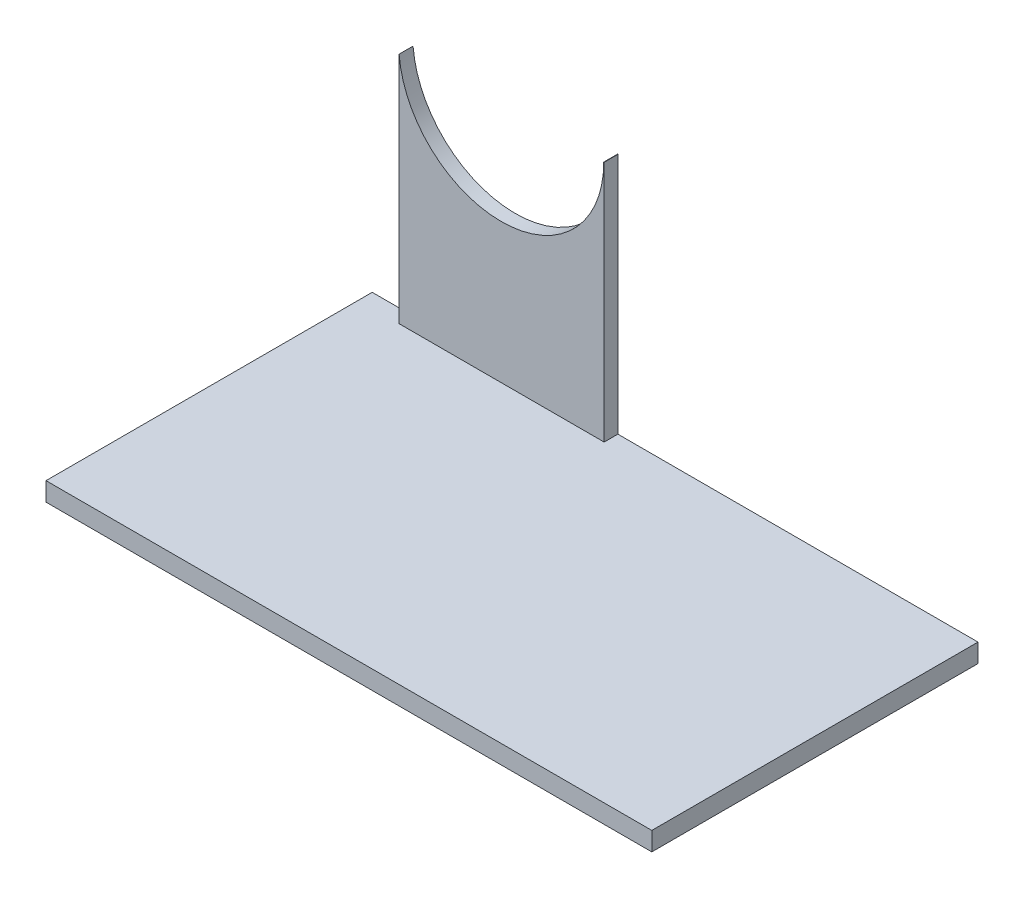
ISO-10303-21;
HEADER;
FILE_DESCRIPTION(('STEP AP214'),'2;1');
FILE_NAME('part.step','',(''),(''),'','','');
FILE_SCHEMA(('AUTOMOTIVE_DESIGN { 1 0 10303 214 1 1 1 1 }'));
ENDSEC;
DATA;
#1=APPLICATION_CONTEXT('core data for automotive mechanical design processes');
#2=APPLICATION_PROTOCOL_DEFINITION('international standard','automotive_design',2000,#1);
#3=PRODUCT_CONTEXT('',#1,'mechanical');
#4=PRODUCT('Part','Part','',(#3));
#5=PRODUCT_RELATED_PRODUCT_CATEGORY('part','',(#4));
#6=PRODUCT_DEFINITION_FORMATION('','',#4);
#7=PRODUCT_DEFINITION_CONTEXT('part definition',#1,'design');
#8=PRODUCT_DEFINITION('design','',#6,#7);
#9=PRODUCT_DEFINITION_SHAPE('','',#8);
#10=(LENGTH_UNIT() NAMED_UNIT(*) SI_UNIT(.MILLI.,.METRE.));
#11=(NAMED_UNIT(*) PLANE_ANGLE_UNIT() SI_UNIT($,.RADIAN.));
#12=(NAMED_UNIT(*) SI_UNIT($,.STERADIAN.) SOLID_ANGLE_UNIT());
#13=UNCERTAINTY_MEASURE_WITH_UNIT(LENGTH_MEASURE(1.E-05),#10,'distance_accuracy_value','');
#14=(GEOMETRIC_REPRESENTATION_CONTEXT(3) GLOBAL_UNCERTAINTY_ASSIGNED_CONTEXT((#13)) GLOBAL_UNIT_ASSIGNED_CONTEXT((#10,
#11,#12)) REPRESENTATION_CONTEXT('',''));
#15=CARTESIAN_POINT('',(0.,0.,0.));
#16=DIRECTION('',(0.,0.,1.));
#17=DIRECTION('',(1.,0.,0.));
#18=AXIS2_PLACEMENT_3D('',#15,#16,#17);
#19=CARTESIAN_POINT('',(-23.7948717948718,77.824115301167,-15.5897435897436));
#20=DIRECTION('',(1.,0.,0.));
#21=DIRECTION('',(0.,0.,-1.));
#22=AXIS2_PLACEMENT_3D('',#19,#20,#21);
#23=PLANE('',#22);
#24=DIRECTION('',(0.,0.,1.));
#25=VECTOR('',#24,1.);
#26=CARTESIAN_POINT('',(-23.7948717948718,2.,-15.5897435897436));
#27=LINE('',#26,#25);
#28=CARTESIAN_POINT('',(-23.7948717948718,2.,-15.5897435897436));
#29=VERTEX_POINT('',#28);
#30=CARTESIAN_POINT('',(-23.7948717948718,2.,19.4102564102564));
#31=VERTEX_POINT('',#30);
#32=EDGE_CURVE('E193',#29,#31,#27,.T.);
#33=ORIENTED_EDGE('',*,*,#32,.F.);
#34=DIRECTION('',(0.,-1.,0.));
#35=VECTOR('',#34,1.);
#36=CARTESIAN_POINT('',(-23.7948717948718,77.824115301167,-15.5897435897436));
#37=LINE('',#36,#35);
#38=CARTESIAN_POINT('',(-23.7948717948718,0.,-15.5897435897436));
#39=VERTEX_POINT('',#38);
#40=EDGE_CURVE('E184',#29,#39,#37,.T.);
#41=ORIENTED_EDGE('',*,*,#40,.T.);
#42=DIRECTION('',(0.,0.,1.));
#43=VECTOR('',#42,1.);
#44=CARTESIAN_POINT('',(-23.7948717948718,0.,-15.5897435897436));
#45=LINE('',#44,#43);
#46=CARTESIAN_POINT('',(-23.7948717948718,0.,19.4102564102564));
#47=VERTEX_POINT('',#46);
#48=EDGE_CURVE('E180',#39,#47,#45,.T.);
#49=ORIENTED_EDGE('',*,*,#48,.T.);
#50=DIRECTION('',(0.,-1.,0.));
#51=VECTOR('',#50,1.);
#52=CARTESIAN_POINT('',(-23.7948717948718,77.824115301167,19.4102564102564));
#53=LINE('',#52,#51);
#54=EDGE_CURVE('E179',#31,#47,#53,.T.);
#55=ORIENTED_EDGE('',*,*,#54,.F.);
#56=EDGE_LOOP('',(#33,#41,#49,#55));
#57=FACE_BOUND('',#56,.T.);
#58=ADVANCED_FACE('F42',(#57),#23,.F.);
#59=CARTESIAN_POINT('',(-23.7948717948718,77.824115301167,19.4102564102564));
#60=DIRECTION('',(0.,0.,-1.));
#61=DIRECTION('',(-1.,0.,0.));
#62=AXIS2_PLACEMENT_3D('',#59,#60,#61);
#63=PLANE('',#62);
#64=DIRECTION('',(1.,0.,0.));
#65=VECTOR('',#64,1.);
#66=CARTESIAN_POINT('',(-23.7948717948718,2.,19.4102564102564));
#67=LINE('',#66,#65);
#68=CARTESIAN_POINT('',(41.2051282051282,2.,19.4102564102564));
#69=VERTEX_POINT('',#68);
#70=EDGE_CURVE('E189',#31,#69,#67,.T.);
#71=ORIENTED_EDGE('',*,*,#70,.F.);
#72=ORIENTED_EDGE('',*,*,#54,.T.);
#73=DIRECTION('',(1.,0.,0.));
#74=VECTOR('',#73,1.);
#75=CARTESIAN_POINT('',(-23.7948717948718,0.,19.4102564102564));
#76=LINE('',#75,#74);
#77=CARTESIAN_POINT('',(41.2051282051282,0.,19.4102564102564));
#78=VERTEX_POINT('',#77);
#79=EDGE_CURVE('E175',#47,#78,#76,.T.);
#80=ORIENTED_EDGE('',*,*,#79,.T.);
#81=DIRECTION('',(0.,-1.,0.));
#82=VECTOR('',#81,1.);
#83=CARTESIAN_POINT('',(41.2051282051282,77.824115301167,19.4102564102564));
#84=LINE('',#83,#82);
#85=EDGE_CURVE('E174',#69,#78,#84,.T.);
#86=ORIENTED_EDGE('',*,*,#85,.F.);
#87=EDGE_LOOP('',(#71,#72,#80,#86));
#88=FACE_BOUND('',#87,.T.);
#89=ADVANCED_FACE('F244',(#88),#63,.F.);
#90=CARTESIAN_POINT('',(41.2051282051282,77.824115301167,-15.5897435897436));
#91=DIRECTION('',(-1.,0.,0.));
#92=DIRECTION('',(0.,0.,1.));
#93=AXIS2_PLACEMENT_3D('',#90,#91,#92);
#94=PLANE('',#93);
#95=DIRECTION('',(0.,0.,-1.));
#96=VECTOR('',#95,1.);
#97=CARTESIAN_POINT('',(41.2051282051282,2.,-15.5897435897436));
#98=LINE('',#97,#96);
#99=CARTESIAN_POINT('',(41.2051282051282,2.,-15.5897435897436));
#100=VERTEX_POINT('',#99);
#101=EDGE_CURVE('E185',#69,#100,#98,.T.);
#102=ORIENTED_EDGE('',*,*,#101,.F.);
#103=ORIENTED_EDGE('',*,*,#85,.T.);
#104=DIRECTION('',(0.,0.,-1.));
#105=VECTOR('',#104,1.);
#106=CARTESIAN_POINT('',(41.2051282051282,0.,-15.5897435897436));
#107=LINE('',#106,#105);
#108=CARTESIAN_POINT('',(41.2051282051282,0.,-15.5897435897436));
#109=VERTEX_POINT('',#108);
#110=EDGE_CURVE('E170',#78,#109,#107,.T.);
#111=ORIENTED_EDGE('',*,*,#110,.T.);
#112=DIRECTION('',(0.,-1.,0.));
#113=VECTOR('',#112,1.);
#114=CARTESIAN_POINT('',(41.2051282051282,77.824115301167,-15.5897435897436));
#115=LINE('',#114,#113);
#116=EDGE_CURVE('E169',#100,#109,#115,.T.);
#117=ORIENTED_EDGE('',*,*,#116,.F.);
#118=EDGE_LOOP('',(#102,#103,#111,#117));
#119=FACE_BOUND('',#118,.T.);
#120=ADVANCED_FACE('F250',(#119),#94,.F.);
#121=CARTESIAN_POINT('',(-23.7948717948718,77.824115301167,-15.5897435897436));
#122=DIRECTION('',(0.,0.,1.));
#123=DIRECTION('',(1.,0.,0.));
#124=AXIS2_PLACEMENT_3D('',#121,#122,#123);
#125=PLANE('',#124);
#126=DIRECTION('',(-1.,0.,0.));
#127=VECTOR('',#126,1.);
#128=CARTESIAN_POINT('',(-23.7948717948718,2.,-15.5897435897436));
#129=LINE('',#128,#127);
#130=CARTESIAN_POINT('',(2.56561817411338,2.,-15.5897435897436));
#131=VERTEX_POINT('',#130);
#132=EDGE_CURVE('E197',#100,#131,#129,.T.);
#133=ORIENTED_EDGE('',*,*,#132,.F.);
#134=ORIENTED_EDGE('',*,*,#116,.T.);
#135=DIRECTION('',(-1.,0.,0.));
#136=VECTOR('',#135,1.);
#137=CARTESIAN_POINT('',(-23.7948717948718,0.,-15.5897435897436));
#138=LINE('',#137,#136);
#139=EDGE_CURVE('E164',#109,#39,#138,.T.);
#140=ORIENTED_EDGE('',*,*,#139,.T.);
#141=ORIENTED_EDGE('',*,*,#40,.F.);
#142=CARTESIAN_POINT('',(-19.4374584778743,2.,-15.5897435897436));
#143=VERTEX_POINT('',#142);
#144=EDGE_CURVE('E168',#143,#29,#129,.T.);
#145=ORIENTED_EDGE('',*,*,#144,.F.);
#146=EDGE_CURVE('E201',#131,#143,#129,.T.);
#147=ORIENTED_EDGE('',*,*,#146,.F.);
#148=EDGE_LOOP('',(#133,#134,#140,#141,#145,#147));
#149=FACE_BOUND('',#148,.T.);
#150=ADVANCED_FACE('F238',(#149),#125,.F.);
#151=CARTESIAN_POINT('',(0.,0.,0.));
#152=DIRECTION('',(0.,1.,0.));
#153=DIRECTION('',(0.,0.,1.));
#154=AXIS2_PLACEMENT_3D('',#151,#152,#153);
#155=PLANE('',#154);
#156=ORIENTED_EDGE('',*,*,#48,.F.);
#157=ORIENTED_EDGE('',*,*,#139,.F.);
#158=ORIENTED_EDGE('',*,*,#110,.F.);
#159=ORIENTED_EDGE('',*,*,#79,.F.);
#160=EDGE_LOOP('',(#156,#157,#158,#159));
#161=FACE_BOUND('',#160,.T.);
#162=ADVANCED_FACE('F248',(#161),#155,.F.);
#163=CARTESIAN_POINT('',(0.,2.,0.));
#164=DIRECTION('',(0.,1.,0.));
#165=DIRECTION('',(0.,0.,1.));
#166=AXIS2_PLACEMENT_3D('',#163,#164,#165);
#167=PLANE('',#166);
#168=DIRECTION('',(0.,0.,1.));
#169=VECTOR('',#168,1.);
#170=CARTESIAN_POINT('',(-19.4374584778743,2.,-15.6167906288971));
#171=LINE('',#170,#169);
#172=CARTESIAN_POINT('',(-19.4374584778743,2.,-14.1167906288971));
#173=VERTEX_POINT('',#172);
#174=EDGE_CURVE('E51',#143,#173,#171,.T.);
#175=ORIENTED_EDGE('',*,*,#174,.F.);
#176=ORIENTED_EDGE('',*,*,#144,.T.);
#177=ORIENTED_EDGE('',*,*,#32,.T.);
#178=ORIENTED_EDGE('',*,*,#70,.T.);
#179=ORIENTED_EDGE('',*,*,#101,.T.);
#180=ORIENTED_EDGE('',*,*,#132,.T.);
#181=DIRECTION('',(0.,0.,-1.));
#182=VECTOR('',#181,1.);
#183=CARTESIAN_POINT('',(2.56561817411338,2.,-15.6167906288971));
#184=LINE('',#183,#182);
#185=CARTESIAN_POINT('',(2.56561817411338,2.,-14.1167906288971));
#186=VERTEX_POINT('',#185);
#187=EDGE_CURVE('E160',#186,#131,#184,.T.);
#188=ORIENTED_EDGE('',*,*,#187,.F.);
#189=DIRECTION('',(1.,0.,0.));
#190=VECTOR('',#189,1.);
#191=CARTESIAN_POINT('',(-19.4374584778743,2.,-14.1167906288971));
#192=LINE('',#191,#190);
#193=EDGE_CURVE('E151',#173,#186,#192,.T.);
#194=ORIENTED_EDGE('',*,*,#193,.F.);
#195=EDGE_LOOP('',(#175,#176,#177,#178,#179,#180,#188,#194));
#196=FACE_BOUND('',#195,.T.);
#197=ADVANCED_FACE('F44',(#196),#167,.T.);
#198=CARTESIAN_POINT('',(0.,2.,0.));
#199=DIRECTION('',(0.,1.,0.));
#200=DIRECTION('',(0.,0.,1.));
#201=AXIS2_PLACEMENT_3D('',#198,#199,#200);
#202=PLANE('',#201);
#203=CARTESIAN_POINT('',(2.56561817411338,2.,-15.6167906288971));
#204=VERTEX_POINT('',#203);
#205=EDGE_CURVE('E157',#131,#204,#184,.T.);
#206=ORIENTED_EDGE('',*,*,#205,.F.);
#207=ORIENTED_EDGE('',*,*,#146,.T.);
#208=CARTESIAN_POINT('',(-19.4374584778743,2.,-15.6167906288971));
#209=VERTEX_POINT('',#208);
#210=EDGE_CURVE('E152',#209,#143,#171,.T.);
#211=ORIENTED_EDGE('',*,*,#210,.F.);
#212=DIRECTION('',(-1.,0.,0.));
#213=VECTOR('',#212,1.);
#214=CARTESIAN_POINT('',(-19.4374584778743,2.,-15.6167906288971));
#215=LINE('',#214,#213);
#216=EDGE_CURVE('E140',#204,#209,#215,.T.);
#217=ORIENTED_EDGE('',*,*,#216,.F.);
#218=EDGE_LOOP('',(#206,#207,#211,#217));
#219=FACE_BOUND('',#218,.T.);
#220=ADVANCED_FACE('F254',(#219),#202,.F.);
#221=CARTESIAN_POINT('',(-19.4374584778743,76.0541465977091,-15.6167906288971));
#222=DIRECTION('',(1.,0.,0.));
#223=DIRECTION('',(0.,0.,-1.));
#224=AXIS2_PLACEMENT_3D('',#221,#222,#223);
#225=PLANE('',#224);
#226=DIRECTION('',(0.,-1.,0.));
#227=VECTOR('',#226,1.);
#228=CARTESIAN_POINT('',(-19.4374584778743,76.0541465977091,-14.1167906288971));
#229=LINE('',#228,#227);
#230=CARTESIAN_POINT('',(-19.4374584778743,27.044521570774,-14.1167906288971));
#231=VERTEX_POINT('',#230);
#232=EDGE_CURVE('E64',#231,#173,#229,.T.);
#233=ORIENTED_EDGE('',*,*,#232,.F.);
#234=DIRECTION('',(0.,0.,-1.));
#235=VECTOR('',#234,1.);
#236=CARTESIAN_POINT('',(-19.4374584778743,27.044521570774,19.4102564102564));
#237=LINE('',#236,#235);
#238=CARTESIAN_POINT('',(-19.4374584778743,27.044521570774,-15.6167906288971));
#239=VERTEX_POINT('',#238);
#240=EDGE_CURVE('E163',#231,#239,#237,.T.);
#241=ORIENTED_EDGE('',*,*,#240,.T.);
#242=DIRECTION('',(0.,-1.,0.));
#243=VECTOR('',#242,1.);
#244=CARTESIAN_POINT('',(-19.4374584778743,76.0541465977091,-15.6167906288971));
#245=LINE('',#244,#243);
#246=EDGE_CURVE('E132',#239,#209,#245,.T.);
#247=ORIENTED_EDGE('',*,*,#246,.T.);
#248=ORIENTED_EDGE('',*,*,#210,.T.);
#249=ORIENTED_EDGE('',*,*,#174,.T.);
#250=EDGE_LOOP('',(#233,#241,#247,#248,#249));
#251=FACE_BOUND('',#250,.T.);
#252=ADVANCED_FACE('F228',(#251),#225,.F.);
#253=CARTESIAN_POINT('',(-19.4374584778743,76.0541465977091,-14.1167906288971));
#254=DIRECTION('',(0.,0.,-1.));
#255=DIRECTION('',(-1.,0.,0.));
#256=AXIS2_PLACEMENT_3D('',#253,#254,#255);
#257=PLANE('',#256);
#258=DIRECTION('',(1.,0.,0.));
#259=VECTOR('',#258,1.);
#260=CARTESIAN_POINT('',(-19.4374584778743,28.,-14.1167906288971));
#261=LINE('',#260,#259);
#262=CARTESIAN_POINT('',(2.52332766828715,28.,-14.1167906288971));
#263=VERTEX_POINT('',#262);
#264=CARTESIAN_POINT('',(2.56561817411338,28.,-14.1167906288971));
#265=VERTEX_POINT('',#264);
#266=EDGE_CURVE('E139',#263,#265,#261,.T.);
#267=ORIENTED_EDGE('',*,*,#266,.F.);
#268=CARTESIAN_POINT('',(-8.47663693483363,27.9720942642143,-14.1167906288971));
#269=DIRECTION('',(0.,0.,-1.));
#270=DIRECTION('',(-1.,0.,0.));
#271=AXIS2_PLACEMENT_3D('',#268,#269,#270);
#272=CIRCLE('',#271,11.);
#273=EDGE_CURVE('E57',#263,#231,#272,.T.);
#274=ORIENTED_EDGE('',*,*,#273,.T.);
#275=ORIENTED_EDGE('',*,*,#232,.T.);
#276=ORIENTED_EDGE('',*,*,#193,.T.);
#277=DIRECTION('',(0.,-1.,0.));
#278=VECTOR('',#277,1.);
#279=CARTESIAN_POINT('',(2.56561817411338,76.0541465977091,-14.1167906288971));
#280=LINE('',#279,#278);
#281=EDGE_CURVE('E153',#265,#186,#280,.T.);
#282=ORIENTED_EDGE('',*,*,#281,.F.);
#283=EDGE_LOOP('',(#267,#274,#275,#276,#282));
#284=FACE_BOUND('',#283,.T.);
#285=ADVANCED_FACE('F224',(#284),#257,.F.);
#286=CARTESIAN_POINT('',(2.56561817411338,76.0541465977091,-15.6167906288971));
#287=DIRECTION('',(-1.,0.,0.));
#288=DIRECTION('',(0.,0.,1.));
#289=AXIS2_PLACEMENT_3D('',#286,#287,#288);
#290=PLANE('',#289);
#291=DIRECTION('',(0.,0.,-1.));
#292=VECTOR('',#291,1.);
#293=CARTESIAN_POINT('',(2.56561817411338,28.,-15.6167906288971));
#294=LINE('',#293,#292);
#295=CARTESIAN_POINT('',(2.56561817411338,28.,-15.6167906288971));
#296=VERTEX_POINT('',#295);
#297=EDGE_CURVE('E137',#265,#296,#294,.T.);
#298=ORIENTED_EDGE('',*,*,#297,.F.);
#299=ORIENTED_EDGE('',*,*,#281,.T.);
#300=ORIENTED_EDGE('',*,*,#187,.T.);
#301=ORIENTED_EDGE('',*,*,#205,.T.);
#302=DIRECTION('',(0.,-1.,0.));
#303=VECTOR('',#302,1.);
#304=CARTESIAN_POINT('',(2.56561817411338,76.0541465977091,-15.6167906288971));
#305=LINE('',#304,#303);
#306=EDGE_CURVE('E145',#296,#204,#305,.T.);
#307=ORIENTED_EDGE('',*,*,#306,.F.);
#308=EDGE_LOOP('',(#298,#299,#300,#301,#307));
#309=FACE_BOUND('',#308,.T.);
#310=ADVANCED_FACE('F257',(#309),#290,.F.);
#311=CARTESIAN_POINT('',(-19.4374584778743,76.0541465977091,-15.6167906288971));
#312=DIRECTION('',(0.,0.,1.));
#313=DIRECTION('',(1.,0.,0.));
#314=AXIS2_PLACEMENT_3D('',#311,#312,#313);
#315=PLANE('',#314);
#316=ORIENTED_EDGE('',*,*,#246,.F.);
#317=CARTESIAN_POINT('',(-8.47663693483363,27.9720942642143,-15.6167906288971));
#318=DIRECTION('',(0.,0.,-1.));
#319=DIRECTION('',(-1.,0.,0.));
#320=AXIS2_PLACEMENT_3D('',#317,#318,#319);
#321=CIRCLE('',#320,11.);
#322=CARTESIAN_POINT('',(2.52332766828715,28.,-15.6167906288971));
#323=VERTEX_POINT('',#322);
#324=EDGE_CURVE('E119',#323,#239,#321,.T.);
#325=ORIENTED_EDGE('',*,*,#324,.F.);
#326=DIRECTION('',(-1.,0.,0.));
#327=VECTOR('',#326,1.);
#328=CARTESIAN_POINT('',(-19.4374584778743,28.,-15.6167906288971));
#329=LINE('',#328,#327);
#330=EDGE_CURVE('E129',#296,#323,#329,.T.);
#331=ORIENTED_EDGE('',*,*,#330,.F.);
#332=ORIENTED_EDGE('',*,*,#306,.T.);
#333=ORIENTED_EDGE('',*,*,#216,.T.);
#334=EDGE_LOOP('',(#316,#325,#331,#332,#333));
#335=FACE_BOUND('',#334,.T.);
#336=ADVANCED_FACE('F127',(#335),#315,.F.);
#337=CARTESIAN_POINT('',(0.,28.,0.));
#338=DIRECTION('',(0.,1.,0.));
#339=DIRECTION('',(0.,0.,1.));
#340=AXIS2_PLACEMENT_3D('',#337,#338,#339);
#341=PLANE('',#340);
#342=DIRECTION('',(0.,0.,-1.));
#343=VECTOR('',#342,1.);
#344=CARTESIAN_POINT('',(2.52332766828715,28.,19.4102564102564));
#345=LINE('',#344,#343);
#346=EDGE_CURVE('E13',#263,#323,#345,.T.);
#347=ORIENTED_EDGE('',*,*,#346,.F.);
#348=ORIENTED_EDGE('',*,*,#266,.T.);
#349=ORIENTED_EDGE('',*,*,#297,.T.);
#350=ORIENTED_EDGE('',*,*,#330,.T.);
#351=EDGE_LOOP('',(#347,#348,#349,#350));
#352=FACE_BOUND('',#351,.T.);
#353=ADVANCED_FACE('F135',(#352),#341,.T.);
#354=CARTESIAN_POINT('',(-8.47663693483363,27.9720942642143,19.4102564102564));
#355=DIRECTION('',(0.,0.,-1.));
#356=DIRECTION('',(-1.,0.,0.));
#357=AXIS2_PLACEMENT_3D('',#354,#355,#356);
#358=CYLINDRICAL_SURFACE('',#357,11.);
#359=ORIENTED_EDGE('',*,*,#273,.F.);
#360=ORIENTED_EDGE('',*,*,#346,.T.);
#361=ORIENTED_EDGE('',*,*,#324,.T.);
#362=ORIENTED_EDGE('',*,*,#240,.F.);
#363=EDGE_LOOP('',(#359,#360,#361,#362));
#364=FACE_BOUND('',#363,.T.);
#365=ADVANCED_FACE('F118',(#364),#358,.F.);
#366=CLOSED_SHELL('',(#58,#89,#120,#150,#162,#197,#220,#252,#285,#310,#336,#353,#365));
#367=MANIFOLD_SOLID_BREP('B2',#366);
#368=ADVANCED_BREP_SHAPE_REPRESENTATION('',(#18,#367),#14);
#369=SHAPE_DEFINITION_REPRESENTATION(#9,#368);
ENDSEC;
END-ISO-10303-21;
